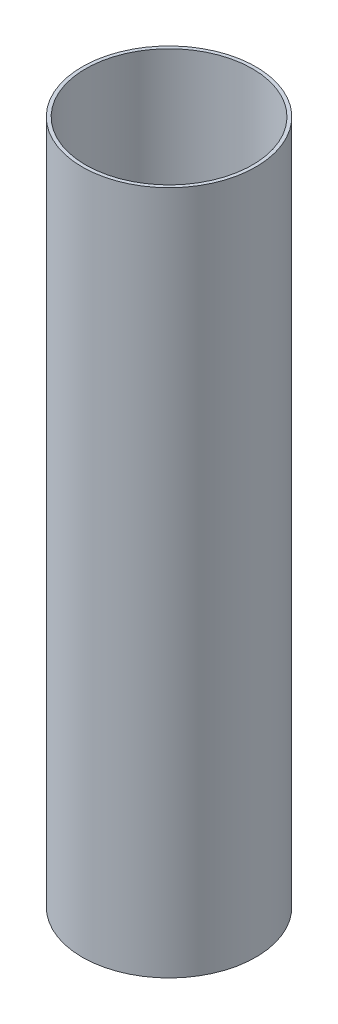
ISO-10303-21;
HEADER;
FILE_DESCRIPTION(('STEP AP214'),'2;1');
FILE_NAME('part.step','',(''),(''),'','','');
FILE_SCHEMA(('AUTOMOTIVE_DESIGN { 1 0 10303 214 1 1 1 1 }'));
ENDSEC;
DATA;
#1=APPLICATION_CONTEXT('core data for automotive mechanical design processes');
#2=APPLICATION_PROTOCOL_DEFINITION('international standard','automotive_design',2000,#1);
#3=PRODUCT_CONTEXT('',#1,'mechanical');
#4=PRODUCT('Part','Part','',(#3));
#5=PRODUCT_RELATED_PRODUCT_CATEGORY('part','',(#4));
#6=PRODUCT_DEFINITION_FORMATION('','',#4);
#7=PRODUCT_DEFINITION_CONTEXT('part definition',#1,'design');
#8=PRODUCT_DEFINITION('design','',#6,#7);
#9=PRODUCT_DEFINITION_SHAPE('','',#8);
#10=(LENGTH_UNIT() NAMED_UNIT(*) SI_UNIT(.MILLI.,.METRE.));
#11=(NAMED_UNIT(*) PLANE_ANGLE_UNIT() SI_UNIT($,.RADIAN.));
#12=(NAMED_UNIT(*) SI_UNIT($,.STERADIAN.) SOLID_ANGLE_UNIT());
#13=UNCERTAINTY_MEASURE_WITH_UNIT(LENGTH_MEASURE(1.E-05),#10,'distance_accuracy_value','');
#14=(GEOMETRIC_REPRESENTATION_CONTEXT(3) GLOBAL_UNCERTAINTY_ASSIGNED_CONTEXT((#13)) GLOBAL_UNIT_ASSIGNED_CONTEXT((#10,
#11,#12)) REPRESENTATION_CONTEXT('',''));
#15=CARTESIAN_POINT('',(0.,0.,0.));
#16=DIRECTION('',(0.,0.,1.));
#17=DIRECTION('',(1.,0.,0.));
#18=AXIS2_PLACEMENT_3D('',#15,#16,#17);
#19=CARTESIAN_POINT('',(0.,406.4,0.));
#20=DIRECTION('',(0.,1.,0.));
#21=DIRECTION('',(0.,0.,1.));
#22=AXIS2_PLACEMENT_3D('',#19,#20,#21);
#23=PLANE('',#22);
#24=CARTESIAN_POINT('',(0.,406.4,0.));
#25=DIRECTION('',(0.,1.,0.));
#26=DIRECTION('',(0.,0.,1.));
#27=AXIS2_PLACEMENT_3D('',#24,#25,#26);
#28=CIRCLE('',#27,51.562);
#29=CARTESIAN_POINT('',(0.,406.4,51.562));
#30=VERTEX_POINT('',#29);
#31=EDGE_CURVE('E10',#30,#30,#28,.T.);
#32=ORIENTED_EDGE('',*,*,#31,.T.);
#33=EDGE_LOOP('',(#32));
#34=FACE_BOUND('',#33,.T.);
#35=CARTESIAN_POINT('',(0.,406.4,0.));
#36=DIRECTION('',(0.,1.,0.));
#37=DIRECTION('',(0.,0.,1.));
#38=AXIS2_PLACEMENT_3D('',#35,#36,#37);
#39=CIRCLE('',#38,49.53);
#40=CARTESIAN_POINT('',(0.,406.4,49.53));
#41=VERTEX_POINT('',#40);
#42=EDGE_CURVE('E43',#41,#41,#39,.T.);
#43=ORIENTED_EDGE('',*,*,#42,.F.);
#44=EDGE_LOOP('',(#43));
#45=FACE_BOUND('',#44,.T.);
#46=ADVANCED_FACE('F32',(#34,#45),#23,.T.);
#47=CARTESIAN_POINT('',(0.,0.,0.));
#48=DIRECTION('',(0.,1.,0.));
#49=DIRECTION('',(0.,0.,1.));
#50=AXIS2_PLACEMENT_3D('',#47,#48,#49);
#51=PLANE('',#50);
#52=CARTESIAN_POINT('',(0.,0.,0.));
#53=DIRECTION('',(0.,1.,0.));
#54=DIRECTION('',(0.,0.,1.));
#55=AXIS2_PLACEMENT_3D('',#52,#53,#54);
#56=CIRCLE('',#55,51.562);
#57=CARTESIAN_POINT('',(0.,0.,51.562));
#58=VERTEX_POINT('',#57);
#59=EDGE_CURVE('E36',#58,#58,#56,.T.);
#60=ORIENTED_EDGE('',*,*,#59,.F.);
#61=EDGE_LOOP('',(#60));
#62=FACE_BOUND('',#61,.T.);
#63=CARTESIAN_POINT('',(0.,0.,0.));
#64=DIRECTION('',(0.,1.,0.));
#65=DIRECTION('',(0.,0.,1.));
#66=AXIS2_PLACEMENT_3D('',#63,#64,#65);
#67=CIRCLE('',#66,49.53);
#68=CARTESIAN_POINT('',(0.,0.,49.53));
#69=VERTEX_POINT('',#68);
#70=EDGE_CURVE('E45',#69,#69,#67,.T.);
#71=ORIENTED_EDGE('',*,*,#70,.T.);
#72=EDGE_LOOP('',(#71));
#73=FACE_BOUND('',#72,.T.);
#74=ADVANCED_FACE('F55',(#62,#73),#51,.F.);
#75=CARTESIAN_POINT('',(0.,406.4,0.));
#76=DIRECTION('',(0.,-1.,0.));
#77=DIRECTION('',(0.,0.,-1.));
#78=AXIS2_PLACEMENT_3D('',#75,#76,#77);
#79=CYLINDRICAL_SURFACE('',#78,51.562);
#80=ORIENTED_EDGE('',*,*,#31,.F.);
#81=EDGE_LOOP('',(#80));
#82=FACE_BOUND('',#81,.T.);
#83=ORIENTED_EDGE('',*,*,#59,.T.);
#84=EDGE_LOOP('',(#83));
#85=FACE_BOUND('',#84,.T.);
#86=ADVANCED_FACE('F34',(#82,#85),#79,.T.);
#87=CARTESIAN_POINT('',(0.,406.4,0.));
#88=DIRECTION('',(0.,-1.,0.));
#89=DIRECTION('',(0.,0.,-1.));
#90=AXIS2_PLACEMENT_3D('',#87,#88,#89);
#91=CYLINDRICAL_SURFACE('',#90,49.53);
#92=ORIENTED_EDGE('',*,*,#42,.T.);
#93=EDGE_LOOP('',(#92));
#94=FACE_BOUND('',#93,.T.);
#95=ORIENTED_EDGE('',*,*,#70,.F.);
#96=EDGE_LOOP('',(#95));
#97=FACE_BOUND('',#96,.T.);
#98=ADVANCED_FACE('F51',(#94,#97),#91,.F.);
#99=CLOSED_SHELL('',(#46,#74,#86,#98));
#100=MANIFOLD_SOLID_BREP('B2',#99);
#101=ADVANCED_BREP_SHAPE_REPRESENTATION('',(#18,#100),#14);
#102=SHAPE_DEFINITION_REPRESENTATION(#9,#101);
ENDSEC;
END-ISO-10303-21;
